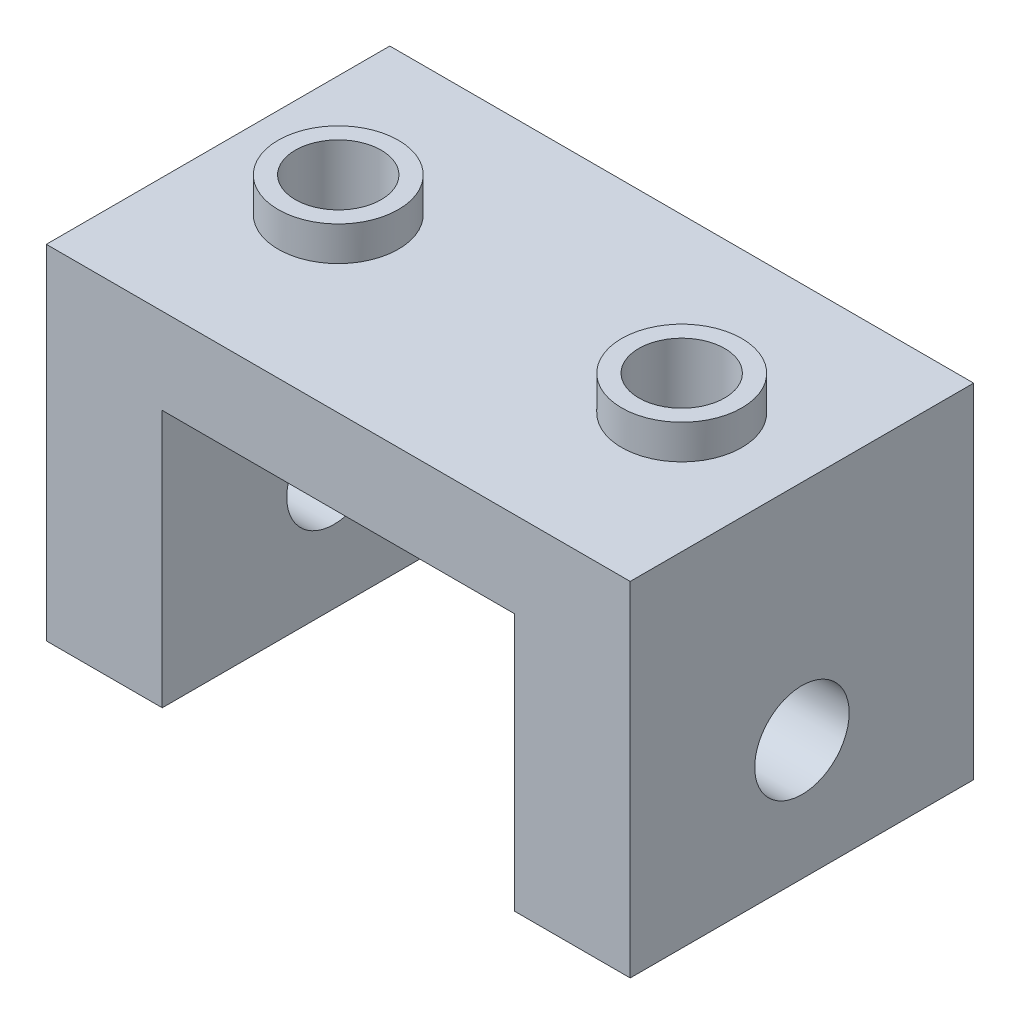
ISO-10303-21;
HEADER;
FILE_DESCRIPTION(('STEP AP214'),'2;1');
FILE_NAME('part.step','',(''),(''),'','','');
FILE_SCHEMA(('AUTOMOTIVE_DESIGN { 1 0 10303 214 1 1 1 1 }'));
ENDSEC;
DATA;
#1=APPLICATION_CONTEXT('core data for automotive mechanical design processes');
#2=APPLICATION_PROTOCOL_DEFINITION('international standard','automotive_design',2000,#1);
#3=PRODUCT_CONTEXT('',#1,'mechanical');
#4=PRODUCT('Part','Part','',(#3));
#5=PRODUCT_RELATED_PRODUCT_CATEGORY('part','',(#4));
#6=PRODUCT_DEFINITION_FORMATION('','',#4);
#7=PRODUCT_DEFINITION_CONTEXT('part definition',#1,'design');
#8=PRODUCT_DEFINITION('design','',#6,#7);
#9=PRODUCT_DEFINITION_SHAPE('','',#8);
#10=(LENGTH_UNIT() NAMED_UNIT(*) SI_UNIT(.MILLI.,.METRE.));
#11=(NAMED_UNIT(*) PLANE_ANGLE_UNIT() SI_UNIT($,.RADIAN.));
#12=(NAMED_UNIT(*) SI_UNIT($,.STERADIAN.) SOLID_ANGLE_UNIT());
#13=UNCERTAINTY_MEASURE_WITH_UNIT(LENGTH_MEASURE(1.E-05),#10,'distance_accuracy_value','');
#14=(GEOMETRIC_REPRESENTATION_CONTEXT(3) GLOBAL_UNCERTAINTY_ASSIGNED_CONTEXT((#13)) GLOBAL_UNIT_ASSIGNED_CONTEXT((#10,
#11,#12)) REPRESENTATION_CONTEXT('',''));
#15=CARTESIAN_POINT('',(0.,0.,0.));
#16=DIRECTION('',(0.,0.,1.));
#17=DIRECTION('',(1.,0.,0.));
#18=AXIS2_PLACEMENT_3D('',#15,#16,#17);
#19=CARTESIAN_POINT('',(0.,0.,0.));
#20=DIRECTION('',(0.,-1.,0.));
#21=DIRECTION('',(0.,0.,-1.));
#22=AXIS2_PLACEMENT_3D('',#19,#20,#21);
#23=PLANE('',#22);
#24=DIRECTION('',(1.,0.,0.));
#25=VECTOR('',#24,1.);
#26=CARTESIAN_POINT('',(-17.,0.,10.));
#27=LINE('',#26,#25);
#28=CARTESIAN_POINT('',(-10.25,0.,10.));
#29=VERTEX_POINT('',#28);
#30=CARTESIAN_POINT('',(10.25,0.,10.));
#31=VERTEX_POINT('',#30);
#32=EDGE_CURVE('E61',#29,#31,#27,.T.);
#33=ORIENTED_EDGE('',*,*,#32,.F.);
#34=DIRECTION('',(0.,0.,1.));
#35=VECTOR('',#34,1.);
#36=CARTESIAN_POINT('',(-10.25,0.,-10.));
#37=LINE('',#36,#35);
#38=CARTESIAN_POINT('',(-10.25,0.,-10.));
#39=VERTEX_POINT('',#38);
#40=EDGE_CURVE('E138',#39,#29,#37,.T.);
#41=ORIENTED_EDGE('',*,*,#40,.F.);
#42=DIRECTION('',(1.,0.,0.));
#43=VECTOR('',#42,1.);
#44=CARTESIAN_POINT('',(-17.,0.,-10.));
#45=LINE('',#44,#43);
#46=CARTESIAN_POINT('',(10.25,0.,-10.));
#47=VERTEX_POINT('',#46);
#48=EDGE_CURVE('E204',#39,#47,#45,.T.);
#49=ORIENTED_EDGE('',*,*,#48,.T.);
#50=DIRECTION('',(0.,0.,-1.));
#51=VECTOR('',#50,1.);
#52=CARTESIAN_POINT('',(10.25,0.,-10.));
#53=LINE('',#52,#51);
#54=EDGE_CURVE('E154',#31,#47,#53,.T.);
#55=ORIENTED_EDGE('',*,*,#54,.F.);
#56=EDGE_LOOP('',(#33,#41,#49,#55));
#57=FACE_BOUND('',#56,.T.);
#58=ADVANCED_FACE('F39',(#57),#23,.T.);
#59=CARTESIAN_POINT('',(-17.,5.,-10.));
#60=DIRECTION('',(0.,0.,-1.));
#61=DIRECTION('',(-1.,0.,0.));
#62=AXIS2_PLACEMENT_3D('',#59,#60,#61);
#63=PLANE('',#62);
#64=ORIENTED_EDGE('',*,*,#48,.F.);
#65=DIRECTION('',(0.,1.,0.));
#66=VECTOR('',#65,1.);
#67=CARTESIAN_POINT('',(-10.25,-15.,-10.));
#68=LINE('',#67,#66);
#69=CARTESIAN_POINT('',(-10.25,-15.,-10.));
#70=VERTEX_POINT('',#69);
#71=EDGE_CURVE('E128',#70,#39,#68,.T.);
#72=ORIENTED_EDGE('',*,*,#71,.F.);
#73=DIRECTION('',(1.,0.,0.));
#74=VECTOR('',#73,1.);
#75=CARTESIAN_POINT('',(-17.,-15.,-10.));
#76=LINE('',#75,#74);
#77=CARTESIAN_POINT('',(-17.,-15.,-10.));
#78=VERTEX_POINT('',#77);
#79=EDGE_CURVE('E126',#78,#70,#76,.T.);
#80=ORIENTED_EDGE('',*,*,#79,.F.);
#81=DIRECTION('',(0.,-1.,0.));
#82=VECTOR('',#81,1.);
#83=CARTESIAN_POINT('',(-17.,5.,-10.));
#84=LINE('',#83,#82);
#85=CARTESIAN_POINT('',(-17.,5.,-10.));
#86=VERTEX_POINT('',#85);
#87=EDGE_CURVE('E112',#86,#78,#84,.T.);
#88=ORIENTED_EDGE('',*,*,#87,.F.);
#89=DIRECTION('',(1.,0.,0.));
#90=VECTOR('',#89,1.);
#91=CARTESIAN_POINT('',(-17.,5.,-10.));
#92=LINE('',#91,#90);
#93=CARTESIAN_POINT('',(17.,5.,-10.));
#94=VERTEX_POINT('',#93);
#95=EDGE_CURVE('E205',#86,#94,#92,.T.);
#96=ORIENTED_EDGE('',*,*,#95,.T.);
#97=DIRECTION('',(0.,-1.,0.));
#98=VECTOR('',#97,1.);
#99=CARTESIAN_POINT('',(17.,5.,-10.));
#100=LINE('',#99,#98);
#101=CARTESIAN_POINT('',(17.,-15.,-10.));
#102=VERTEX_POINT('',#101);
#103=EDGE_CURVE('E217',#94,#102,#100,.T.);
#104=ORIENTED_EDGE('',*,*,#103,.T.);
#105=DIRECTION('',(1.,0.,0.));
#106=VECTOR('',#105,1.);
#107=CARTESIAN_POINT('',(17.,-15.,-10.));
#108=LINE('',#107,#106);
#109=CARTESIAN_POINT('',(10.25,-15.,-10.));
#110=VERTEX_POINT('',#109);
#111=EDGE_CURVE('E165',#110,#102,#108,.T.);
#112=ORIENTED_EDGE('',*,*,#111,.F.);
#113=DIRECTION('',(0.,1.,0.));
#114=VECTOR('',#113,1.);
#115=CARTESIAN_POINT('',(10.25,-15.,-10.));
#116=LINE('',#115,#114);
#117=EDGE_CURVE('E169',#110,#47,#116,.T.);
#118=ORIENTED_EDGE('',*,*,#117,.T.);
#119=EDGE_LOOP('',(#64,#72,#80,#88,#96,#104,#112,#118));
#120=FACE_BOUND('',#119,.T.);
#121=ADVANCED_FACE('F41',(#120),#63,.T.);
#122=CARTESIAN_POINT('',(-17.,5.,-10.));
#123=DIRECTION('',(1.,0.,0.));
#124=DIRECTION('',(0.,0.,-1.));
#125=AXIS2_PLACEMENT_3D('',#122,#123,#124);
#126=PLANE('',#125);
#127=CARTESIAN_POINT('',(-17.,-8.,0.));
#128=DIRECTION('',(1.,0.,0.));
#129=DIRECTION('',(0.,0.,-1.));
#130=AXIS2_PLACEMENT_3D('',#127,#128,#129);
#131=CIRCLE('',#130,2.74999999999999);
#132=CARTESIAN_POINT('',(-17.,-8.,-2.74999999999999));
#133=VERTEX_POINT('',#132);
#134=EDGE_CURVE('E290',#133,#133,#131,.T.);
#135=ORIENTED_EDGE('',*,*,#134,.T.);
#136=EDGE_LOOP('',(#135));
#137=FACE_BOUND('',#136,.T.);
#138=ORIENTED_EDGE('',*,*,#87,.T.);
#139=DIRECTION('',(0.,0.,-1.));
#140=VECTOR('',#139,1.);
#141=CARTESIAN_POINT('',(-17.,-15.,-10.));
#142=LINE('',#141,#140);
#143=CARTESIAN_POINT('',(-17.,-15.,10.));
#144=VERTEX_POINT('',#143);
#145=EDGE_CURVE('E117',#144,#78,#142,.T.);
#146=ORIENTED_EDGE('',*,*,#145,.F.);
#147=DIRECTION('',(0.,-1.,0.));
#148=VECTOR('',#147,1.);
#149=CARTESIAN_POINT('',(-17.,5.,10.));
#150=LINE('',#149,#148);
#151=CARTESIAN_POINT('',(-17.,5.,10.));
#152=VERTEX_POINT('',#151);
#153=EDGE_CURVE('E123',#152,#144,#150,.T.);
#154=ORIENTED_EDGE('',*,*,#153,.F.);
#155=DIRECTION('',(0.,0.,1.));
#156=VECTOR('',#155,1.);
#157=CARTESIAN_POINT('',(-17.,5.,-10.));
#158=LINE('',#157,#156);
#159=EDGE_CURVE('E118',#86,#152,#158,.T.);
#160=ORIENTED_EDGE('',*,*,#159,.F.);
#161=EDGE_LOOP('',(#138,#146,#154,#160));
#162=FACE_BOUND('',#161,.T.);
#163=ADVANCED_FACE('F114',(#137,#162),#126,.F.);
#164=CARTESIAN_POINT('',(-17.,5.,10.));
#165=DIRECTION('',(0.,0.,-1.));
#166=DIRECTION('',(-1.,0.,0.));
#167=AXIS2_PLACEMENT_3D('',#164,#165,#166);
#168=PLANE('',#167);
#169=ORIENTED_EDGE('',*,*,#153,.T.);
#170=DIRECTION('',(-1.,0.,0.));
#171=VECTOR('',#170,1.);
#172=CARTESIAN_POINT('',(-17.,-15.,10.));
#173=LINE('',#172,#171);
#174=CARTESIAN_POINT('',(-10.25,-15.,10.));
#175=VERTEX_POINT('',#174);
#176=EDGE_CURVE('E136',#175,#144,#173,.T.);
#177=ORIENTED_EDGE('',*,*,#176,.F.);
#178=DIRECTION('',(0.,1.,0.));
#179=VECTOR('',#178,1.);
#180=CARTESIAN_POINT('',(-10.25,-15.,10.));
#181=LINE('',#180,#179);
#182=EDGE_CURVE('E56',#175,#29,#181,.T.);
#183=ORIENTED_EDGE('',*,*,#182,.T.);
#184=ORIENTED_EDGE('',*,*,#32,.T.);
#185=DIRECTION('',(0.,1.,0.));
#186=VECTOR('',#185,1.);
#187=CARTESIAN_POINT('',(10.25,-15.,10.));
#188=LINE('',#187,#186);
#189=CARTESIAN_POINT('',(10.25,-15.,10.));
#190=VERTEX_POINT('',#189);
#191=EDGE_CURVE('E176',#190,#31,#188,.T.);
#192=ORIENTED_EDGE('',*,*,#191,.F.);
#193=DIRECTION('',(-1.,0.,0.));
#194=VECTOR('',#193,1.);
#195=CARTESIAN_POINT('',(17.,-15.,10.));
#196=LINE('',#195,#194);
#197=CARTESIAN_POINT('',(17.,-15.,10.));
#198=VERTEX_POINT('',#197);
#199=EDGE_CURVE('E159',#198,#190,#196,.T.);
#200=ORIENTED_EDGE('',*,*,#199,.F.);
#201=DIRECTION('',(0.,-1.,0.));
#202=VECTOR('',#201,1.);
#203=CARTESIAN_POINT('',(17.,5.,10.));
#204=LINE('',#203,#202);
#205=CARTESIAN_POINT('',(17.,5.,10.));
#206=VERTEX_POINT('',#205);
#207=EDGE_CURVE('E224',#206,#198,#204,.T.);
#208=ORIENTED_EDGE('',*,*,#207,.F.);
#209=DIRECTION('',(1.,0.,0.));
#210=VECTOR('',#209,1.);
#211=CARTESIAN_POINT('',(-17.,5.,10.));
#212=LINE('',#211,#210);
#213=EDGE_CURVE('E212',#152,#206,#212,.T.);
#214=ORIENTED_EDGE('',*,*,#213,.F.);
#215=EDGE_LOOP('',(#169,#177,#183,#184,#192,#200,#208,#214));
#216=FACE_BOUND('',#215,.T.);
#217=ADVANCED_FACE('F252',(#216),#168,.F.);
#218=CARTESIAN_POINT('',(17.,5.,-10.));
#219=DIRECTION('',(1.,0.,0.));
#220=DIRECTION('',(0.,0.,-1.));
#221=AXIS2_PLACEMENT_3D('',#218,#219,#220);
#222=PLANE('',#221);
#223=CARTESIAN_POINT('',(17.,-8.,0.));
#224=DIRECTION('',(1.,0.,0.));
#225=DIRECTION('',(0.,0.,-1.));
#226=AXIS2_PLACEMENT_3D('',#223,#224,#225);
#227=CIRCLE('',#226,2.75);
#228=CARTESIAN_POINT('',(17.,-8.,-2.75));
#229=VERTEX_POINT('',#228);
#230=EDGE_CURVE('E287',#229,#229,#227,.T.);
#231=ORIENTED_EDGE('',*,*,#230,.F.);
#232=EDGE_LOOP('',(#231));
#233=FACE_BOUND('',#232,.T.);
#234=ORIENTED_EDGE('',*,*,#207,.T.);
#235=DIRECTION('',(0.,0.,1.));
#236=VECTOR('',#235,1.);
#237=CARTESIAN_POINT('',(17.,-15.,-10.));
#238=LINE('',#237,#236);
#239=EDGE_CURVE('E155',#102,#198,#238,.T.);
#240=ORIENTED_EDGE('',*,*,#239,.F.);
#241=ORIENTED_EDGE('',*,*,#103,.F.);
#242=DIRECTION('',(0.,0.,1.));
#243=VECTOR('',#242,1.);
#244=CARTESIAN_POINT('',(17.,5.,-10.));
#245=LINE('',#244,#243);
#246=EDGE_CURVE('E208',#94,#206,#245,.T.);
#247=ORIENTED_EDGE('',*,*,#246,.T.);
#248=EDGE_LOOP('',(#234,#240,#241,#247));
#249=FACE_BOUND('',#248,.T.);
#250=ADVANCED_FACE('F238',(#233,#249),#222,.T.);
#251=CARTESIAN_POINT('',(0.,5.,0.));
#252=DIRECTION('',(0.,-1.,0.));
#253=DIRECTION('',(0.,0.,-1.));
#254=AXIS2_PLACEMENT_3D('',#251,#252,#253);
#255=PLANE('',#254);
#256=CARTESIAN_POINT('',(10.,5.,0.));
#257=DIRECTION('',(0.,-1.,0.));
#258=DIRECTION('',(0.,0.,-1.));
#259=AXIS2_PLACEMENT_3D('',#256,#257,#258);
#260=CIRCLE('',#259,3.5);
#261=CARTESIAN_POINT('',(10.,5.,-3.5));
#262=VERTEX_POINT('',#261);
#263=EDGE_CURVE('E11',#262,#262,#260,.F.);
#264=ORIENTED_EDGE('',*,*,#263,.F.);
#265=EDGE_LOOP('',(#264));
#266=FACE_BOUND('',#265,.T.);
#267=CARTESIAN_POINT('',(-10.,5.,0.));
#268=DIRECTION('',(0.,-1.,0.));
#269=DIRECTION('',(0.,0.,-1.));
#270=AXIS2_PLACEMENT_3D('',#267,#268,#269);
#271=CIRCLE('',#270,3.5);
#272=CARTESIAN_POINT('',(-10.,5.,-3.5));
#273=VERTEX_POINT('',#272);
#274=EDGE_CURVE('E49',#273,#273,#271,.F.);
#275=ORIENTED_EDGE('',*,*,#274,.F.);
#276=EDGE_LOOP('',(#275));
#277=FACE_BOUND('',#276,.T.);
#278=ORIENTED_EDGE('',*,*,#95,.F.);
#279=ORIENTED_EDGE('',*,*,#159,.T.);
#280=ORIENTED_EDGE('',*,*,#213,.T.);
#281=ORIENTED_EDGE('',*,*,#246,.F.);
#282=EDGE_LOOP('',(#278,#279,#280,#281));
#283=FACE_BOUND('',#282,.T.);
#284=ADVANCED_FACE('F235',(#266,#277,#283),#255,.F.);
#285=CARTESIAN_POINT('',(-10.,7.,0.));
#286=DIRECTION('',(0.,-1.,0.));
#287=DIRECTION('',(0.,0.,-1.));
#288=AXIS2_PLACEMENT_3D('',#285,#286,#287);
#289=CYLINDRICAL_SURFACE('',#288,3.5);
#290=CARTESIAN_POINT('',(-10.,7.,0.));
#291=DIRECTION('',(0.,1.,0.));
#292=DIRECTION('',(0.,0.,1.));
#293=AXIS2_PLACEMENT_3D('',#290,#291,#292);
#294=CIRCLE('',#293,3.5);
#295=CARTESIAN_POINT('',(-10.,7.,3.5));
#296=VERTEX_POINT('',#295);
#297=EDGE_CURVE('E200',#296,#296,#294,.T.);
#298=ORIENTED_EDGE('',*,*,#297,.F.);
#299=EDGE_LOOP('',(#298));
#300=FACE_BOUND('',#299,.T.);
#301=ORIENTED_EDGE('',*,*,#274,.T.);
#302=EDGE_LOOP('',(#301));
#303=FACE_BOUND('',#302,.T.);
#304=ADVANCED_FACE('F233',(#300,#303),#289,.T.);
#305=CARTESIAN_POINT('',(-10.,7.,0.));
#306=DIRECTION('',(0.,1.,0.));
#307=DIRECTION('',(0.,0.,1.));
#308=AXIS2_PLACEMENT_3D('',#305,#306,#307);
#309=PLANE('',#308);
#310=CARTESIAN_POINT('',(-10.,7.,0.));
#311=DIRECTION('',(0.,1.,0.));
#312=DIRECTION('',(0.,0.,1.));
#313=AXIS2_PLACEMENT_3D('',#310,#311,#312);
#314=CIRCLE('',#313,2.5);
#315=CARTESIAN_POINT('',(-10.,7.,2.5));
#316=VERTEX_POINT('',#315);
#317=EDGE_CURVE('E186',#316,#316,#314,.T.);
#318=ORIENTED_EDGE('',*,*,#317,.F.);
#319=EDGE_LOOP('',(#318));
#320=FACE_BOUND('',#319,.T.);
#321=ORIENTED_EDGE('',*,*,#297,.T.);
#322=EDGE_LOOP('',(#321));
#323=FACE_BOUND('',#322,.T.);
#324=ADVANCED_FACE('F400',(#320,#323),#309,.T.);
#325=CARTESIAN_POINT('',(10.,7.,0.));
#326=DIRECTION('',(0.,-1.,0.));
#327=DIRECTION('',(0.,0.,-1.));
#328=AXIS2_PLACEMENT_3D('',#325,#326,#327);
#329=CYLINDRICAL_SURFACE('',#328,3.5);
#330=CARTESIAN_POINT('',(10.,7.,0.));
#331=DIRECTION('',(0.,1.,0.));
#332=DIRECTION('',(0.,0.,1.));
#333=AXIS2_PLACEMENT_3D('',#330,#331,#332);
#334=CIRCLE('',#333,3.5);
#335=CARTESIAN_POINT('',(10.,7.,3.5));
#336=VERTEX_POINT('',#335);
#337=EDGE_CURVE('E185',#336,#336,#334,.T.);
#338=ORIENTED_EDGE('',*,*,#337,.F.);
#339=EDGE_LOOP('',(#338));
#340=FACE_BOUND('',#339,.T.);
#341=ORIENTED_EDGE('',*,*,#263,.T.);
#342=EDGE_LOOP('',(#341));
#343=FACE_BOUND('',#342,.T.);
#344=ADVANCED_FACE('F391',(#340,#343),#329,.T.);
#345=CARTESIAN_POINT('',(10.,7.,0.));
#346=DIRECTION('',(0.,1.,0.));
#347=DIRECTION('',(0.,0.,1.));
#348=AXIS2_PLACEMENT_3D('',#345,#346,#347);
#349=PLANE('',#348);
#350=CARTESIAN_POINT('',(10.,7.,0.));
#351=DIRECTION('',(0.,1.,0.));
#352=DIRECTION('',(0.,0.,1.));
#353=AXIS2_PLACEMENT_3D('',#350,#351,#352);
#354=CIRCLE('',#353,2.5);
#355=CARTESIAN_POINT('',(10.,7.,2.5));
#356=VERTEX_POINT('',#355);
#357=EDGE_CURVE('E180',#356,#356,#354,.T.);
#358=ORIENTED_EDGE('',*,*,#357,.F.);
#359=EDGE_LOOP('',(#358));
#360=FACE_BOUND('',#359,.T.);
#361=ORIENTED_EDGE('',*,*,#337,.T.);
#362=EDGE_LOOP('',(#361));
#363=FACE_BOUND('',#362,.T.);
#364=ADVANCED_FACE('F383',(#360,#363),#349,.T.);
#365=CARTESIAN_POINT('',(10.,2.5,0.));
#366=DIRECTION('',(0.,1.,0.));
#367=DIRECTION('',(0.,0.,1.));
#368=AXIS2_PLACEMENT_3D('',#365,#366,#367);
#369=CYLINDRICAL_SURFACE('',#368,2.5);
#370=CARTESIAN_POINT('',(10.,2.5,0.));
#371=DIRECTION('',(0.,1.,0.));
#372=DIRECTION('',(0.,0.,1.));
#373=AXIS2_PLACEMENT_3D('',#370,#371,#372);
#374=CIRCLE('',#373,2.5);
#375=CARTESIAN_POINT('',(10.,2.5,2.5));
#376=VERTEX_POINT('',#375);
#377=EDGE_CURVE('E190',#376,#376,#374,.T.);
#378=ORIENTED_EDGE('',*,*,#377,.F.);
#379=EDGE_LOOP('',(#378));
#380=FACE_BOUND('',#379,.T.);
#381=ORIENTED_EDGE('',*,*,#357,.T.);
#382=EDGE_LOOP('',(#381));
#383=FACE_BOUND('',#382,.T.);
#384=ADVANCED_FACE('F375',(#380,#383),#369,.F.);
#385=CARTESIAN_POINT('',(10.,2.5,0.));
#386=DIRECTION('',(0.,1.,0.));
#387=DIRECTION('',(0.,0.,1.));
#388=AXIS2_PLACEMENT_3D('',#385,#386,#387);
#389=PLANE('',#388);
#390=ORIENTED_EDGE('',*,*,#377,.T.);
#391=EDGE_LOOP('',(#390));
#392=FACE_BOUND('',#391,.T.);
#393=ADVANCED_FACE('F367',(#392),#389,.T.);
#394=CARTESIAN_POINT('',(-10.,2.5,0.));
#395=DIRECTION('',(0.,1.,0.));
#396=DIRECTION('',(0.,0.,1.));
#397=AXIS2_PLACEMENT_3D('',#394,#395,#396);
#398=CYLINDRICAL_SURFACE('',#397,2.5);
#399=CARTESIAN_POINT('',(-10.,2.5,0.));
#400=DIRECTION('',(0.,1.,0.));
#401=DIRECTION('',(0.,0.,1.));
#402=AXIS2_PLACEMENT_3D('',#399,#400,#401);
#403=CIRCLE('',#402,2.5);
#404=CARTESIAN_POINT('',(-10.,2.5,2.5));
#405=VERTEX_POINT('',#404);
#406=EDGE_CURVE('E181',#405,#405,#403,.T.);
#407=ORIENTED_EDGE('',*,*,#406,.F.);
#408=EDGE_LOOP('',(#407));
#409=FACE_BOUND('',#408,.T.);
#410=ORIENTED_EDGE('',*,*,#317,.T.);
#411=EDGE_LOOP('',(#410));
#412=FACE_BOUND('',#411,.T.);
#413=ADVANCED_FACE('F359',(#409,#412),#398,.F.);
#414=CARTESIAN_POINT('',(-10.,2.5,0.));
#415=DIRECTION('',(0.,1.,0.));
#416=DIRECTION('',(0.,0.,1.));
#417=AXIS2_PLACEMENT_3D('',#414,#415,#416);
#418=PLANE('',#417);
#419=ORIENTED_EDGE('',*,*,#406,.T.);
#420=EDGE_LOOP('',(#419));
#421=FACE_BOUND('',#420,.T.);
#422=ADVANCED_FACE('F344',(#421),#418,.T.);
#423=CARTESIAN_POINT('',(10.25,-15.,-10.));
#424=DIRECTION('',(1.,0.,0.));
#425=DIRECTION('',(0.,0.,-1.));
#426=AXIS2_PLACEMENT_3D('',#423,#424,#425);
#427=PLANE('',#426);
#428=CARTESIAN_POINT('',(10.25,-8.,0.));
#429=DIRECTION('',(1.,0.,0.));
#430=DIRECTION('',(0.,0.,-1.));
#431=AXIS2_PLACEMENT_3D('',#428,#429,#430);
#432=CIRCLE('',#431,2.75);
#433=CARTESIAN_POINT('',(10.25,-8.,-2.75));
#434=VERTEX_POINT('',#433);
#435=EDGE_CURVE('E141',#434,#434,#432,.T.);
#436=ORIENTED_EDGE('',*,*,#435,.T.);
#437=EDGE_LOOP('',(#436));
#438=FACE_BOUND('',#437,.T.);
#439=ORIENTED_EDGE('',*,*,#54,.T.);
#440=ORIENTED_EDGE('',*,*,#117,.F.);
#441=DIRECTION('',(0.,0.,-1.));
#442=VECTOR('',#441,1.);
#443=CARTESIAN_POINT('',(10.25,-15.,-10.));
#444=LINE('',#443,#442);
#445=EDGE_CURVE('E162',#190,#110,#444,.T.);
#446=ORIENTED_EDGE('',*,*,#445,.F.);
#447=ORIENTED_EDGE('',*,*,#191,.T.);
#448=EDGE_LOOP('',(#439,#440,#446,#447));
#449=FACE_BOUND('',#448,.T.);
#450=ADVANCED_FACE('F254',(#438,#449),#427,.F.);
#451=CARTESIAN_POINT('',(0.,-15.,0.));
#452=DIRECTION('',(0.,-1.,0.));
#453=DIRECTION('',(0.,0.,-1.));
#454=AXIS2_PLACEMENT_3D('',#451,#452,#453);
#455=PLANE('',#454);
#456=ORIENTED_EDGE('',*,*,#239,.T.);
#457=ORIENTED_EDGE('',*,*,#199,.T.);
#458=ORIENTED_EDGE('',*,*,#445,.T.);
#459=ORIENTED_EDGE('',*,*,#111,.T.);
#460=EDGE_LOOP('',(#456,#457,#458,#459));
#461=FACE_BOUND('',#460,.T.);
#462=ADVANCED_FACE('F246',(#461),#455,.T.);
#463=CARTESIAN_POINT('',(-10.25,-15.,-10.));
#464=DIRECTION('',(-1.,0.,0.));
#465=DIRECTION('',(0.,0.,1.));
#466=AXIS2_PLACEMENT_3D('',#463,#464,#465);
#467=PLANE('',#466);
#468=CARTESIAN_POINT('',(-10.25,-8.,0.));
#469=DIRECTION('',(-1.,0.,0.));
#470=DIRECTION('',(0.,0.,1.));
#471=AXIS2_PLACEMENT_3D('',#468,#469,#470);
#472=CIRCLE('',#471,2.75);
#473=CARTESIAN_POINT('',(-10.25,-8.,2.75));
#474=VERTEX_POINT('',#473);
#475=EDGE_CURVE('E43',#474,#474,#472,.T.);
#476=ORIENTED_EDGE('',*,*,#475,.T.);
#477=EDGE_LOOP('',(#476));
#478=FACE_BOUND('',#477,.T.);
#479=ORIENTED_EDGE('',*,*,#40,.T.);
#480=ORIENTED_EDGE('',*,*,#182,.F.);
#481=DIRECTION('',(0.,0.,1.));
#482=VECTOR('',#481,1.);
#483=CARTESIAN_POINT('',(-10.25,-15.,-10.));
#484=LINE('',#483,#482);
#485=EDGE_CURVE('E132',#70,#175,#484,.T.);
#486=ORIENTED_EDGE('',*,*,#485,.F.);
#487=ORIENTED_EDGE('',*,*,#71,.T.);
#488=EDGE_LOOP('',(#479,#480,#486,#487));
#489=FACE_BOUND('',#488,.T.);
#490=ADVANCED_FACE('F258',(#478,#489),#467,.F.);
#491=CARTESIAN_POINT('',(0.,-15.,0.));
#492=DIRECTION('',(0.,1.,0.));
#493=DIRECTION('',(0.,0.,1.));
#494=AXIS2_PLACEMENT_3D('',#491,#492,#493);
#495=PLANE('',#494);
#496=ORIENTED_EDGE('',*,*,#145,.T.);
#497=ORIENTED_EDGE('',*,*,#79,.T.);
#498=ORIENTED_EDGE('',*,*,#485,.T.);
#499=ORIENTED_EDGE('',*,*,#176,.T.);
#500=EDGE_LOOP('',(#496,#497,#498,#499));
#501=FACE_BOUND('',#500,.T.);
#502=ADVANCED_FACE('F135',(#501),#495,.F.);
#503=CARTESIAN_POINT('',(17.,-8.,0.));
#504=DIRECTION('',(1.,0.,0.));
#505=DIRECTION('',(0.,0.,-1.));
#506=AXIS2_PLACEMENT_3D('',#503,#504,#505);
#507=CYLINDRICAL_SURFACE('',#506,2.75);
#508=ORIENTED_EDGE('',*,*,#134,.F.);
#509=EDGE_LOOP('',(#508));
#510=FACE_BOUND('',#509,.T.);
#511=ORIENTED_EDGE('',*,*,#475,.F.);
#512=EDGE_LOOP('',(#511));
#513=FACE_BOUND('',#512,.T.);
#514=ADVANCED_FACE('F266',(#510,#513),#507,.F.);
#515=ORIENTED_EDGE('',*,*,#230,.T.);
#516=EDGE_LOOP('',(#515));
#517=FACE_BOUND('',#516,.T.);
#518=ORIENTED_EDGE('',*,*,#435,.F.);
#519=EDGE_LOOP('',(#518));
#520=FACE_BOUND('',#519,.T.);
#521=ADVANCED_FACE('F302',(#517,#520),#507,.F.);
#522=CLOSED_SHELL('',(#58,#121,#163,#217,#250,#284,#304,#324,#344,#364,#384,#393,#413,#422,#450,
#462,#490,#502,#514,#521));
#523=MANIFOLD_SOLID_BREP('B2',#522);
#524=ADVANCED_BREP_SHAPE_REPRESENTATION('',(#18,#523),#14);
#525=SHAPE_DEFINITION_REPRESENTATION(#9,#524);
ENDSEC;
END-ISO-10303-21;
